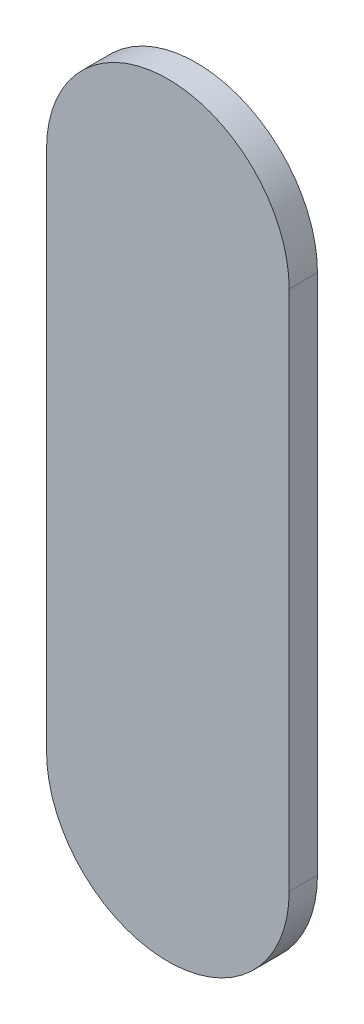
ISO-10303-21;
HEADER;
FILE_DESCRIPTION(('STEP AP214'),'2;1');
FILE_NAME('part.step','',(''),(''),'','','');
FILE_SCHEMA(('AUTOMOTIVE_DESIGN { 1 0 10303 214 1 1 1 1 }'));
ENDSEC;
DATA;
#1=APPLICATION_CONTEXT('core data for automotive mechanical design processes');
#2=APPLICATION_PROTOCOL_DEFINITION('international standard','automotive_design',2000,#1);
#3=PRODUCT_CONTEXT('',#1,'mechanical');
#4=PRODUCT('Part','Part','',(#3));
#5=PRODUCT_RELATED_PRODUCT_CATEGORY('part','',(#4));
#6=PRODUCT_DEFINITION_FORMATION('','',#4);
#7=PRODUCT_DEFINITION_CONTEXT('part definition',#1,'design');
#8=PRODUCT_DEFINITION('design','',#6,#7);
#9=PRODUCT_DEFINITION_SHAPE('','',#8);
#10=(LENGTH_UNIT() NAMED_UNIT(*) SI_UNIT(.MILLI.,.METRE.));
#11=(NAMED_UNIT(*) PLANE_ANGLE_UNIT() SI_UNIT($,.RADIAN.));
#12=(NAMED_UNIT(*) SI_UNIT($,.STERADIAN.) SOLID_ANGLE_UNIT());
#13=UNCERTAINTY_MEASURE_WITH_UNIT(LENGTH_MEASURE(1.E-05),#10,'distance_accuracy_value','');
#14=(GEOMETRIC_REPRESENTATION_CONTEXT(3) GLOBAL_UNCERTAINTY_ASSIGNED_CONTEXT((#13)) GLOBAL_UNIT_ASSIGNED_CONTEXT((#10,
#11,#12)) REPRESENTATION_CONTEXT('',''));
#15=CARTESIAN_POINT('',(0.,0.,0.));
#16=DIRECTION('',(0.,0.,1.));
#17=DIRECTION('',(1.,0.,0.));
#18=AXIS2_PLACEMENT_3D('',#15,#16,#17);
#19=CARTESIAN_POINT('',(89.41,-74.195,1.635));
#20=DIRECTION('',(0.,0.,1.));
#21=DIRECTION('',(1.,0.,0.));
#22=AXIS2_PLACEMENT_3D('',#19,#20,#21);
#23=PLANE('',#22);
#24=DIRECTION('',(0.,-1.,0.));
#25=VECTOR('',#24,1.);
#26=CARTESIAN_POINT('',(89.41,-74.195,1.635));
#27=LINE('',#26,#25);
#28=CARTESIAN_POINT('',(89.41,-74.195,1.635));
#29=VERTEX_POINT('',#28);
#30=CARTESIAN_POINT('',(89.41,-74.84,1.635));
#31=VERTEX_POINT('',#30);
#32=EDGE_CURVE('E74',#29,#31,#27,.T.);
#33=ORIENTED_EDGE('',*,*,#32,.T.);
#34=CARTESIAN_POINT('',(89.56,-74.84,1.635));
#35=DIRECTION('',(0.,0.,1.));
#36=DIRECTION('',(-1.,0.,0.));
#37=AXIS2_PLACEMENT_3D('',#34,#35,#36);
#38=CIRCLE('',#37,0.15);
#39=CARTESIAN_POINT('',(89.71,-74.84,1.635));
#40=VERTEX_POINT('',#39);
#41=EDGE_CURVE('E72',#31,#40,#38,.T.);
#42=ORIENTED_EDGE('',*,*,#41,.T.);
#43=DIRECTION('',(0.,1.,0.));
#44=VECTOR('',#43,1.);
#45=CARTESIAN_POINT('',(89.71,-74.84,1.635));
#46=LINE('',#45,#44);
#47=CARTESIAN_POINT('',(89.71,-74.195,1.635));
#48=VERTEX_POINT('',#47);
#49=EDGE_CURVE('E60',#40,#48,#46,.T.);
#50=ORIENTED_EDGE('',*,*,#49,.T.);
#51=CARTESIAN_POINT('',(89.56,-74.195,1.635));
#52=DIRECTION('',(0.,0.,1.));
#53=DIRECTION('',(1.,0.,0.));
#54=AXIS2_PLACEMENT_3D('',#51,#52,#53);
#55=CIRCLE('',#54,0.15);
#56=EDGE_CURVE('E11',#48,#29,#55,.T.);
#57=ORIENTED_EDGE('',*,*,#56,.T.);
#58=EDGE_LOOP('',(#33,#42,#50,#57));
#59=FACE_BOUND('',#58,.T.);
#60=ADVANCED_FACE('F17',(#59),#23,.T.);
#61=CARTESIAN_POINT('',(89.41,-74.195,1.6));
#62=DIRECTION('',(0.,0.,1.));
#63=DIRECTION('',(1.,0.,0.));
#64=AXIS2_PLACEMENT_3D('',#61,#62,#63);
#65=PLANE('',#64);
#66=CARTESIAN_POINT('',(89.56,-74.195,1.6));
#67=DIRECTION('',(0.,0.,1.));
#68=DIRECTION('',(1.,0.,0.));
#69=AXIS2_PLACEMENT_3D('',#66,#67,#68);
#70=CIRCLE('',#69,0.15);
#71=CARTESIAN_POINT('',(89.71,-74.195,1.6));
#72=VERTEX_POINT('',#71);
#73=CARTESIAN_POINT('',(89.41,-74.195,1.6));
#74=VERTEX_POINT('',#73);
#75=EDGE_CURVE('E26',#72,#74,#70,.T.);
#76=ORIENTED_EDGE('',*,*,#75,.F.);
#77=DIRECTION('',(0.,1.,0.));
#78=VECTOR('',#77,1.);
#79=CARTESIAN_POINT('',(89.71,-74.84,1.6));
#80=LINE('',#79,#78);
#81=CARTESIAN_POINT('',(89.71,-74.84,1.6));
#82=VERTEX_POINT('',#81);
#83=EDGE_CURVE('E79',#82,#72,#80,.T.);
#84=ORIENTED_EDGE('',*,*,#83,.F.);
#85=CARTESIAN_POINT('',(89.56,-74.84,1.6));
#86=DIRECTION('',(0.,0.,1.));
#87=DIRECTION('',(-1.,0.,0.));
#88=AXIS2_PLACEMENT_3D('',#85,#86,#87);
#89=CIRCLE('',#88,0.15);
#90=CARTESIAN_POINT('',(89.41,-74.84,1.6));
#91=VERTEX_POINT('',#90);
#92=EDGE_CURVE('E83',#91,#82,#89,.T.);
#93=ORIENTED_EDGE('',*,*,#92,.F.);
#94=DIRECTION('',(0.,-1.,0.));
#95=VECTOR('',#94,1.);
#96=CARTESIAN_POINT('',(89.41,-74.195,1.6));
#97=LINE('',#96,#95);
#98=EDGE_CURVE('E109',#74,#91,#97,.T.);
#99=ORIENTED_EDGE('',*,*,#98,.F.);
#100=EDGE_LOOP('',(#76,#84,#93,#99));
#101=FACE_BOUND('',#100,.T.);
#102=ADVANCED_FACE('F111',(#101),#65,.F.);
#103=CARTESIAN_POINT('',(89.56,-74.195,1.6));
#104=DIRECTION('',(0.,0.,-1.));
#105=DIRECTION('',(1.,0.,0.));
#106=AXIS2_PLACEMENT_3D('',#103,#104,#105);
#107=CYLINDRICAL_SURFACE('',#106,0.15);
#108=ORIENTED_EDGE('',*,*,#75,.T.);
#109=DIRECTION('',(0.,0.,1.));
#110=VECTOR('',#109,1.);
#111=CARTESIAN_POINT('',(89.41,-74.195,1.6));
#112=LINE('',#111,#110);
#113=EDGE_CURVE('E90',#74,#29,#112,.T.);
#114=ORIENTED_EDGE('',*,*,#113,.T.);
#115=ORIENTED_EDGE('',*,*,#56,.F.);
#116=DIRECTION('',(0.,0.,1.));
#117=VECTOR('',#116,1.);
#118=CARTESIAN_POINT('',(89.71,-74.195,1.6));
#119=LINE('',#118,#117);
#120=EDGE_CURVE('E67',#72,#48,#119,.T.);
#121=ORIENTED_EDGE('',*,*,#120,.F.);
#122=EDGE_LOOP('',(#108,#114,#115,#121));
#123=FACE_BOUND('',#122,.T.);
#124=ADVANCED_FACE('F102',(#123),#107,.T.);
#125=CARTESIAN_POINT('',(89.71,-74.84,1.6));
#126=DIRECTION('',(-1.,0.,0.));
#127=DIRECTION('',(0.,0.,1.));
#128=AXIS2_PLACEMENT_3D('',#125,#126,#127);
#129=PLANE('',#128);
#130=ORIENTED_EDGE('',*,*,#83,.T.);
#131=ORIENTED_EDGE('',*,*,#120,.T.);
#132=ORIENTED_EDGE('',*,*,#49,.F.);
#133=DIRECTION('',(0.,0.,1.));
#134=VECTOR('',#133,1.);
#135=CARTESIAN_POINT('',(89.71,-74.84,1.6));
#136=LINE('',#135,#134);
#137=EDGE_CURVE('E65',#82,#40,#136,.T.);
#138=ORIENTED_EDGE('',*,*,#137,.F.);
#139=EDGE_LOOP('',(#130,#131,#132,#138));
#140=FACE_BOUND('',#139,.T.);
#141=ADVANCED_FACE('F63',(#140),#129,.F.);
#142=CARTESIAN_POINT('',(89.56,-74.84,1.6));
#143=DIRECTION('',(0.,0.,-1.));
#144=DIRECTION('',(-1.,0.,0.));
#145=AXIS2_PLACEMENT_3D('',#142,#143,#144);
#146=CYLINDRICAL_SURFACE('',#145,0.15);
#147=ORIENTED_EDGE('',*,*,#92,.T.);
#148=ORIENTED_EDGE('',*,*,#137,.T.);
#149=ORIENTED_EDGE('',*,*,#41,.F.);
#150=DIRECTION('',(0.,0.,1.));
#151=VECTOR('',#150,1.);
#152=CARTESIAN_POINT('',(89.41,-74.84,1.6));
#153=LINE('',#152,#151);
#154=EDGE_CURVE('E113',#91,#31,#153,.T.);
#155=ORIENTED_EDGE('',*,*,#154,.F.);
#156=EDGE_LOOP('',(#147,#148,#149,#155));
#157=FACE_BOUND('',#156,.T.);
#158=ADVANCED_FACE('F81',(#157),#146,.T.);
#159=CARTESIAN_POINT('',(89.41,-74.195,1.6));
#160=DIRECTION('',(1.,0.,0.));
#161=DIRECTION('',(0.,1.,0.));
#162=AXIS2_PLACEMENT_3D('',#159,#160,#161);
#163=PLANE('',#162);
#164=ORIENTED_EDGE('',*,*,#98,.T.);
#165=ORIENTED_EDGE('',*,*,#154,.T.);
#166=ORIENTED_EDGE('',*,*,#32,.F.);
#167=ORIENTED_EDGE('',*,*,#113,.F.);
#168=EDGE_LOOP('',(#164,#165,#166,#167));
#169=FACE_BOUND('',#168,.T.);
#170=ADVANCED_FACE('F108',(#169),#163,.F.);
#171=CLOSED_SHELL('',(#60,#102,#124,#141,#158,#170));
#172=MANIFOLD_SOLID_BREP('B1',#171);
#173=ADVANCED_BREP_SHAPE_REPRESENTATION('',(#18,#172),#14);
#174=SHAPE_DEFINITION_REPRESENTATION(#9,#173);
ENDSEC;
END-ISO-10303-21;
